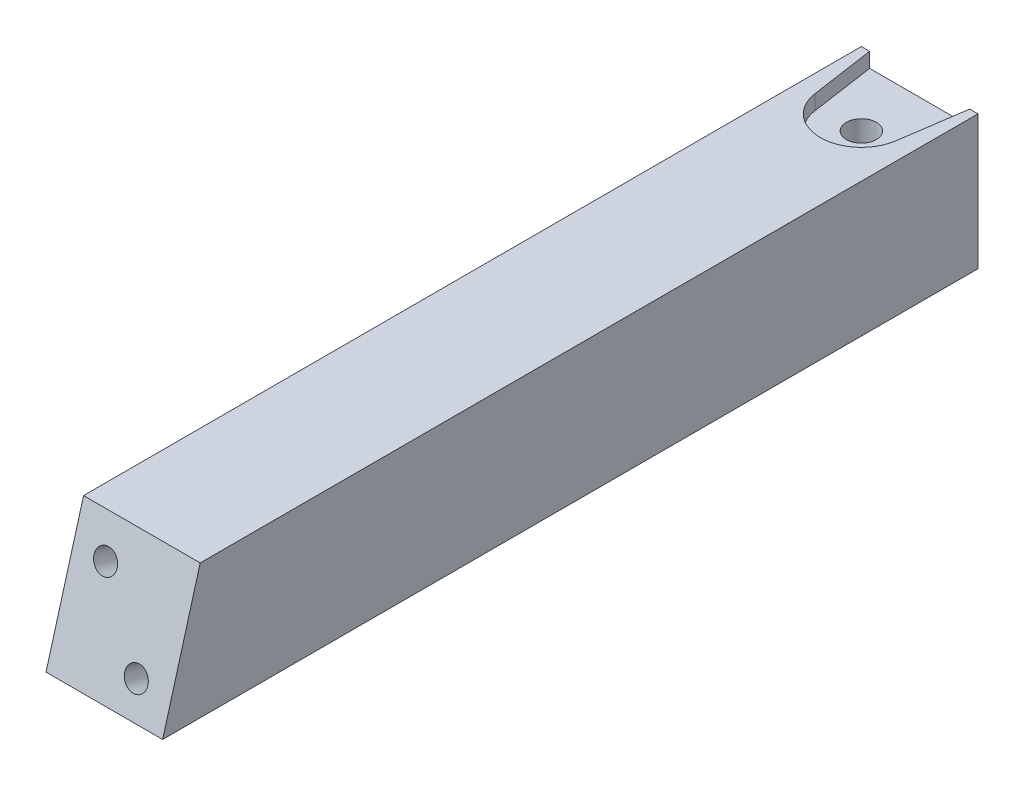
ISO-10303-21;
HEADER;
FILE_DESCRIPTION(('STEP AP214'),'2;1');
FILE_NAME('part.step','',(''),(''),'','','');
FILE_SCHEMA(('AUTOMOTIVE_DESIGN { 1 0 10303 214 1 1 1 1 }'));
ENDSEC;
DATA;
#1=APPLICATION_CONTEXT('core data for automotive mechanical design processes');
#2=APPLICATION_PROTOCOL_DEFINITION('international standard','automotive_design',2000,#1);
#3=PRODUCT_CONTEXT('',#1,'mechanical');
#4=PRODUCT('Part','Part','',(#3));
#5=PRODUCT_RELATED_PRODUCT_CATEGORY('part','',(#4));
#6=PRODUCT_DEFINITION_FORMATION('','',#4);
#7=PRODUCT_DEFINITION_CONTEXT('part definition',#1,'design');
#8=PRODUCT_DEFINITION('design','',#6,#7);
#9=PRODUCT_DEFINITION_SHAPE('','',#8);
#10=(LENGTH_UNIT() NAMED_UNIT(*) SI_UNIT(.MILLI.,.METRE.));
#11=(NAMED_UNIT(*) PLANE_ANGLE_UNIT() SI_UNIT($,.RADIAN.));
#12=(NAMED_UNIT(*) SI_UNIT($,.STERADIAN.) SOLID_ANGLE_UNIT());
#13=UNCERTAINTY_MEASURE_WITH_UNIT(LENGTH_MEASURE(1.E-05),#10,'distance_accuracy_value','');
#14=(GEOMETRIC_REPRESENTATION_CONTEXT(3) GLOBAL_UNCERTAINTY_ASSIGNED_CONTEXT((#13)) GLOBAL_UNIT_ASSIGNED_CONTEXT((#10,
#11,#12)) REPRESENTATION_CONTEXT('',''));
#15=CARTESIAN_POINT('',(0.,0.,0.));
#16=DIRECTION('',(0.,0.,1.));
#17=DIRECTION('',(1.,0.,0.));
#18=AXIS2_PLACEMENT_3D('',#15,#16,#17);
#19=CARTESIAN_POINT('',(0.,14.605,-12.7));
#20=DIRECTION('',(0.,1.,0.));
#21=DIRECTION('',(0.,0.,-1.));
#22=AXIS2_PLACEMENT_3D('',#19,#20,#21);
#23=PLANE('',#22);
#24=DIRECTION('',(-0.145074568979481,0.,-0.989420724179264));
#25=VECTOR('',#24,1.);
#26=CARTESIAN_POINT('',(-10.6691680815078,14.605,-11.1356250854981));
#27=LINE('',#26,#25);
#28=CARTESIAN_POINT('',(-8.84621281074196,14.605,1.29708270633174));
#29=VERTEX_POINT('',#28);
#30=CARTESIAN_POINT('',(-10.8985457475476,14.605,-12.7));
#31=VERTEX_POINT('',#30);
#32=EDGE_CURVE('E235',#29,#31,#27,.T.);
#33=ORIENTED_EDGE('',*,*,#32,.T.);
#34=DIRECTION('',(1.,0.,0.));
#35=VECTOR('',#34,1.);
#36=CARTESIAN_POINT('',(0.,14.605,-12.7));
#37=LINE('',#36,#35);
#38=CARTESIAN_POINT('',(-12.7,14.605,-12.7));
#39=VERTEX_POINT('',#38);
#40=EDGE_CURVE('E177',#39,#31,#37,.T.);
#41=ORIENTED_EDGE('',*,*,#40,.F.);
#42=DIRECTION('',(0.,0.,1.));
#43=VECTOR('',#42,1.);
#44=CARTESIAN_POINT('',(-12.7,14.605,-12.7));
#45=LINE('',#44,#43);
#46=CARTESIAN_POINT('',(-12.7,14.605,156.672537514928));
#47=VERTEX_POINT('',#46);
#48=EDGE_CURVE('E185',#39,#47,#45,.T.);
#49=ORIENTED_EDGE('',*,*,#48,.T.);
#50=DIRECTION('',(1.,0.,0.));
#51=VECTOR('',#50,1.);
#52=CARTESIAN_POINT('',(0.,14.605,156.672537514928));
#53=LINE('',#52,#51);
#54=CARTESIAN_POINT('',(12.7,14.605,156.672537514928));
#55=VERTEX_POINT('',#54);
#56=EDGE_CURVE('E173',#47,#55,#53,.T.);
#57=ORIENTED_EDGE('',*,*,#56,.T.);
#58=DIRECTION('',(0.,0.,1.));
#59=VECTOR('',#58,1.);
#60=CARTESIAN_POINT('',(12.7,14.605,-12.7));
#61=LINE('',#60,#59);
#62=CARTESIAN_POINT('',(12.7,14.605,-12.7));
#63=VERTEX_POINT('',#62);
#64=EDGE_CURVE('E188',#63,#55,#61,.T.);
#65=ORIENTED_EDGE('',*,*,#64,.F.);
#66=CARTESIAN_POINT('',(10.8985457475476,14.605,-12.7));
#67=VERTEX_POINT('',#66);
#68=EDGE_CURVE('E176',#67,#63,#37,.T.);
#69=ORIENTED_EDGE('',*,*,#68,.F.);
#70=DIRECTION('',(0.145074568979481,0.,-0.989420724179264));
#71=VECTOR('',#70,1.);
#72=CARTESIAN_POINT('',(10.6691680815078,14.605,-11.1356250854981));
#73=LINE('',#72,#71);
#74=CARTESIAN_POINT('',(8.84621281074195,14.605,1.29708270633174));
#75=VERTEX_POINT('',#74);
#76=EDGE_CURVE('E232',#75,#67,#73,.T.);
#77=ORIENTED_EDGE('',*,*,#76,.F.);
#78=CARTESIAN_POINT('',(0.,14.605,0.));
#79=DIRECTION('',(0.,-1.,0.));
#80=DIRECTION('',(0.,0.,-1.));
#81=AXIS2_PLACEMENT_3D('',#78,#79,#80);
#82=CIRCLE('',#81,8.9408);
#83=EDGE_CURVE('E51',#29,#75,#82,.F.);
#84=ORIENTED_EDGE('',*,*,#83,.F.);
#85=EDGE_LOOP('',(#33,#41,#49,#57,#65,#69,#77,#84));
#86=FACE_BOUND('',#85,.T.);
#87=ADVANCED_FACE('F43',(#86),#23,.T.);
#88=CARTESIAN_POINT('',(0.,-14.605,-12.7));
#89=DIRECTION('',(0.,1.,0.));
#90=DIRECTION('',(0.,0.,-1.));
#91=AXIS2_PLACEMENT_3D('',#88,#89,#90);
#92=PLANE('',#91);
#93=DIRECTION('',(-1.,0.,0.));
#94=VECTOR('',#93,1.);
#95=CARTESIAN_POINT('',(0.,-14.605,145.067348417265));
#96=LINE('',#95,#94);
#97=CARTESIAN_POINT('',(6.99258936750375,-14.605,145.067348417265));
#98=VERTEX_POINT('',#97);
#99=CARTESIAN_POINT('',(3.16741063249625,-14.605,145.067348417265));
#100=VERTEX_POINT('',#99);
#101=EDGE_CURVE('E11',#98,#100,#96,.T.);
#102=ORIENTED_EDGE('',*,*,#101,.T.);
#103=CARTESIAN_POINT('',(5.08,-14.605,138.939159755567));
#104=DIRECTION('',(0.,-1.,0.));
#105=DIRECTION('',(0.,0.,1.));
#106=AXIS2_PLACEMENT_3D('',#103,#104,#105);
#107=ELLIPSE('',#106,9.37491821077206,2.5273);
#108=EDGE_CURVE('E141',#98,#100,#107,.T.);
#109=ORIENTED_EDGE('',*,*,#108,.F.);
#110=EDGE_LOOP('',(#102,#109));
#111=FACE_BOUND('',#110,.T.);
#112=DIRECTION('',(1.,0.,0.));
#113=VECTOR('',#112,1.);
#114=CARTESIAN_POINT('',(0.,-14.605,-12.7));
#115=LINE('',#114,#113);
#116=CARTESIAN_POINT('',(10.8985457475476,-14.605,-12.7));
#117=VERTEX_POINT('',#116);
#118=CARTESIAN_POINT('',(12.7,-14.605,-12.7));
#119=VERTEX_POINT('',#118);
#120=EDGE_CURVE('E154',#117,#119,#115,.T.);
#121=ORIENTED_EDGE('',*,*,#120,.T.);
#122=DIRECTION('',(0.,0.,1.));
#123=VECTOR('',#122,1.);
#124=CARTESIAN_POINT('',(12.7,-14.605,-12.7));
#125=LINE('',#124,#123);
#126=CARTESIAN_POINT('',(12.7,-14.605,164.849737725037));
#127=VERTEX_POINT('',#126);
#128=EDGE_CURVE('E157',#119,#127,#125,.T.);
#129=ORIENTED_EDGE('',*,*,#128,.T.);
#130=DIRECTION('',(1.,0.,0.));
#131=VECTOR('',#130,1.);
#132=CARTESIAN_POINT('',(0.,-14.605,164.849737725037));
#133=LINE('',#132,#131);
#134=CARTESIAN_POINT('',(-12.7,-14.605,164.849737725037));
#135=VERTEX_POINT('',#134);
#136=EDGE_CURVE('E164',#135,#127,#133,.T.);
#137=ORIENTED_EDGE('',*,*,#136,.F.);
#138=DIRECTION('',(0.,0.,1.));
#139=VECTOR('',#138,1.);
#140=CARTESIAN_POINT('',(-12.7,-14.605,-12.7));
#141=LINE('',#140,#139);
#142=CARTESIAN_POINT('',(-12.7,-14.605,-12.7));
#143=VERTEX_POINT('',#142);
#144=EDGE_CURVE('E182',#143,#135,#141,.T.);
#145=ORIENTED_EDGE('',*,*,#144,.F.);
#146=CARTESIAN_POINT('',(-10.8985457475476,-14.605,-12.7));
#147=VERTEX_POINT('',#146);
#148=EDGE_CURVE('E163',#143,#147,#115,.T.);
#149=ORIENTED_EDGE('',*,*,#148,.T.);
#150=DIRECTION('',(0.145074568979481,0.,0.989420724179264));
#151=VECTOR('',#150,1.);
#152=CARTESIAN_POINT('',(-10.6691680815078,-14.605,-11.1356250854981));
#153=LINE('',#152,#151);
#154=CARTESIAN_POINT('',(-8.84621281074195,-14.605,1.29708270633174));
#155=VERTEX_POINT('',#154);
#156=EDGE_CURVE('E246',#147,#155,#153,.T.);
#157=ORIENTED_EDGE('',*,*,#156,.T.);
#158=CARTESIAN_POINT('',(0.,-14.605,0.));
#159=DIRECTION('',(0.,-1.,0.));
#160=DIRECTION('',(0.,0.,-1.));
#161=AXIS2_PLACEMENT_3D('',#158,#159,#160);
#162=CIRCLE('',#161,8.9408);
#163=CARTESIAN_POINT('',(8.84621281074196,-14.605,1.29708270633174));
#164=VERTEX_POINT('',#163);
#165=EDGE_CURVE('E200',#164,#155,#162,.T.);
#166=ORIENTED_EDGE('',*,*,#165,.F.);
#167=DIRECTION('',(-0.145074568979481,0.,0.989420724179264));
#168=VECTOR('',#167,1.);
#169=CARTESIAN_POINT('',(10.6691680815078,-14.605,-11.1356250854981));
#170=LINE('',#169,#168);
#171=EDGE_CURVE('E160',#117,#164,#170,.T.);
#172=ORIENTED_EDGE('',*,*,#171,.F.);
#173=EDGE_LOOP('',(#121,#129,#137,#145,#149,#157,#166,#172));
#174=FACE_BOUND('',#173,.T.);
#175=ADVANCED_FACE('F45',(#111,#174),#92,.F.);
#176=CARTESIAN_POINT('',(12.7,0.,-12.7));
#177=DIRECTION('',(-1.,0.,0.));
#178=DIRECTION('',(0.,0.,-1.));
#179=AXIS2_PLACEMENT_3D('',#176,#177,#178);
#180=PLANE('',#179);
#181=DIRECTION('',(0.,0.962977712328957,-0.26958101854116));
#182=VECTOR('',#181,1.);
#183=CARTESIAN_POINT('',(12.7,-10.2420351219003,163.628346512511));
#184=LINE('',#183,#182);
#185=EDGE_CURVE('E169',#127,#55,#184,.T.);
#186=ORIENTED_EDGE('',*,*,#185,.F.);
#187=ORIENTED_EDGE('',*,*,#128,.F.);
#188=DIRECTION('',(0.,1.,0.));
#189=VECTOR('',#188,1.);
#190=CARTESIAN_POINT('',(12.7,0.,-12.7));
#191=LINE('',#190,#189);
#192=EDGE_CURVE('E167',#119,#63,#191,.T.);
#193=ORIENTED_EDGE('',*,*,#192,.T.);
#194=ORIENTED_EDGE('',*,*,#64,.T.);
#195=EDGE_LOOP('',(#186,#187,#193,#194));
#196=FACE_BOUND('',#195,.T.);
#197=ADVANCED_FACE('F149',(#196),#180,.F.);
#198=CARTESIAN_POINT('',(-12.7,0.,-12.7));
#199=DIRECTION('',(-1.,0.,0.));
#200=DIRECTION('',(0.,0.,-1.));
#201=AXIS2_PLACEMENT_3D('',#198,#199,#200);
#202=PLANE('',#201);
#203=DIRECTION('',(0.,0.962977712328957,-0.26958101854116));
#204=VECTOR('',#203,1.);
#205=CARTESIAN_POINT('',(-12.7,-10.2420351219003,163.628346512511));
#206=LINE('',#205,#204);
#207=EDGE_CURVE('E255',#135,#47,#206,.T.);
#208=ORIENTED_EDGE('',*,*,#207,.T.);
#209=ORIENTED_EDGE('',*,*,#48,.F.);
#210=DIRECTION('',(0.,1.,0.));
#211=VECTOR('',#210,1.);
#212=CARTESIAN_POINT('',(-12.7,0.,-12.7));
#213=LINE('',#212,#211);
#214=EDGE_CURVE('E180',#143,#39,#213,.T.);
#215=ORIENTED_EDGE('',*,*,#214,.F.);
#216=ORIENTED_EDGE('',*,*,#144,.T.);
#217=EDGE_LOOP('',(#208,#209,#215,#216));
#218=FACE_BOUND('',#217,.T.);
#219=ADVANCED_FACE('F280',(#218),#202,.T.);
#220=CARTESIAN_POINT('',(0.,0.,-12.7));
#221=DIRECTION('',(0.,0.,-1.));
#222=DIRECTION('',(1.,0.,0.));
#223=AXIS2_PLACEMENT_3D('',#220,#221,#222);
#224=PLANE('',#223);
#225=DIRECTION('',(0.,-1.,0.));
#226=VECTOR('',#225,1.);
#227=CARTESIAN_POINT('',(-10.8985457475476,0.,-12.7));
#228=LINE('',#227,#226);
#229=CARTESIAN_POINT('',(-10.8985457475476,11.3792,-12.7));
#230=VERTEX_POINT('',#229);
#231=EDGE_CURVE('E208',#31,#230,#228,.T.);
#232=ORIENTED_EDGE('',*,*,#231,.T.);
#233=DIRECTION('',(-1.,0.,0.));
#234=VECTOR('',#233,1.);
#235=CARTESIAN_POINT('',(0.,11.3792,-12.7));
#236=LINE('',#235,#234);
#237=CARTESIAN_POINT('',(10.8985457475476,11.3792,-12.7));
#238=VERTEX_POINT('',#237);
#239=EDGE_CURVE('E203',#238,#230,#236,.T.);
#240=ORIENTED_EDGE('',*,*,#239,.F.);
#241=DIRECTION('',(0.,-1.,0.));
#242=VECTOR('',#241,1.);
#243=CARTESIAN_POINT('',(10.8985457475476,0.,-12.7));
#244=LINE('',#243,#242);
#245=EDGE_CURVE('E205',#67,#238,#244,.T.);
#246=ORIENTED_EDGE('',*,*,#245,.F.);
#247=ORIENTED_EDGE('',*,*,#68,.T.);
#248=ORIENTED_EDGE('',*,*,#192,.F.);
#249=ORIENTED_EDGE('',*,*,#120,.F.);
#250=DIRECTION('',(0.,1.,0.));
#251=VECTOR('',#250,1.);
#252=CARTESIAN_POINT('',(10.8985457475476,0.,-12.7));
#253=LINE('',#252,#251);
#254=CARTESIAN_POINT('',(10.8985457475476,-11.3792,-12.7));
#255=VERTEX_POINT('',#254);
#256=EDGE_CURVE('E198',#117,#255,#253,.T.);
#257=ORIENTED_EDGE('',*,*,#256,.T.);
#258=DIRECTION('',(-1.,0.,0.));
#259=VECTOR('',#258,1.);
#260=CARTESIAN_POINT('',(0.,-11.3792,-12.7));
#261=LINE('',#260,#259);
#262=CARTESIAN_POINT('',(-10.8985457475476,-11.3792,-12.7));
#263=VERTEX_POINT('',#262);
#264=EDGE_CURVE('E195',#255,#263,#261,.T.);
#265=ORIENTED_EDGE('',*,*,#264,.T.);
#266=DIRECTION('',(0.,1.,0.));
#267=VECTOR('',#266,1.);
#268=CARTESIAN_POINT('',(-10.8985457475476,0.,-12.7));
#269=LINE('',#268,#267);
#270=EDGE_CURVE('E192',#147,#263,#269,.T.);
#271=ORIENTED_EDGE('',*,*,#270,.F.);
#272=ORIENTED_EDGE('',*,*,#148,.F.);
#273=ORIENTED_EDGE('',*,*,#214,.T.);
#274=ORIENTED_EDGE('',*,*,#40,.T.);
#275=EDGE_LOOP('',(#232,#240,#246,#247,#248,#249,#257,#265,#271,#272,#273,#274));
#276=FACE_BOUND('',#275,.T.);
#277=ADVANCED_FACE('F268',(#276),#224,.T.);
#278=CARTESIAN_POINT('',(-223.778265585856,534.660082965459,11.0855969571135));
#279=DIRECTION('',(0.,0.26958101854116,0.962977712328957));
#280=DIRECTION('',(0.,0.962977712328957,-0.26958101854116));
#281=AXIS2_PLACEMENT_3D('',#278,#279,#280);
#282=PLANE('',#281);
#283=CARTESIAN_POINT('',(-5.71499999999999,6.79717965651106,158.85829958796));
#284=DIRECTION('',(0.,-0.26958101854116,-0.962977712328957));
#285=DIRECTION('',(0.,0.962977712328957,-0.26958101854116));
#286=AXIS2_PLACEMENT_3D('',#283,#284,#285);
#287=CIRCLE('',#286,2.5273);
#288=CARTESIAN_POINT('',(-5.71499999999999,9.23091322888003,158.176987479801));
#289=VERTEX_POINT('',#288);
#290=EDGE_CURVE('E468',#289,#289,#287,.T.);
#291=ORIENTED_EDGE('',*,*,#290,.T.);
#292=EDGE_LOOP('',(#291));
#293=FACE_BOUND('',#292,.T.);
#294=CARTESIAN_POINT('',(5.08,-7.87860067938224,162.966714310527));
#295=DIRECTION('',(0.,-0.26958101854116,-0.962977712328957));
#296=DIRECTION('',(0.,0.962977712328957,-0.26958101854116));
#297=AXIS2_PLACEMENT_3D('',#294,#295,#296);
#298=CIRCLE('',#297,2.5273);
#299=CARTESIAN_POINT('',(5.08,-5.44486710701327,162.285402202368));
#300=VERTEX_POINT('',#299);
#301=EDGE_CURVE('E139',#300,#300,#298,.T.);
#302=ORIENTED_EDGE('',*,*,#301,.T.);
#303=EDGE_LOOP('',(#302));
#304=FACE_BOUND('',#303,.T.);
#305=ORIENTED_EDGE('',*,*,#136,.T.);
#306=ORIENTED_EDGE('',*,*,#185,.T.);
#307=ORIENTED_EDGE('',*,*,#56,.F.);
#308=ORIENTED_EDGE('',*,*,#207,.F.);
#309=EDGE_LOOP('',(#305,#306,#307,#308));
#310=FACE_BOUND('',#309,.T.);
#311=ADVANCED_FACE('F265',(#293,#304,#310),#282,.T.);
#312=CARTESIAN_POINT('',(0.,-14.605,0.));
#313=DIRECTION('',(0.,1.,0.));
#314=DIRECTION('',(0.,0.,1.));
#315=AXIS2_PLACEMENT_3D('',#312,#313,#314);
#316=CYLINDRICAL_SURFACE('',#315,8.9408);
#317=DIRECTION('',(0.,-1.,0.));
#318=VECTOR('',#317,1.);
#319=CARTESIAN_POINT('',(8.84621281074196,-14.605,1.29708270633174));
#320=LINE('',#319,#318);
#321=CARTESIAN_POINT('',(8.84621281074196,-11.3792,1.29708270633174));
#322=VERTEX_POINT('',#321);
#323=EDGE_CURVE('E241',#164,#322,#320,.F.);
#324=ORIENTED_EDGE('',*,*,#323,.F.);
#325=ORIENTED_EDGE('',*,*,#165,.T.);
#326=DIRECTION('',(0.,1.,0.));
#327=VECTOR('',#326,1.);
#328=CARTESIAN_POINT('',(-8.84621281074195,-14.605,1.29708270633174));
#329=LINE('',#328,#327);
#330=CARTESIAN_POINT('',(-8.84621281074195,-11.3792,1.29708270633174));
#331=VERTEX_POINT('',#330);
#332=EDGE_CURVE('E247',#155,#331,#329,.T.);
#333=ORIENTED_EDGE('',*,*,#332,.T.);
#334=CARTESIAN_POINT('',(0.,-11.3792,0.));
#335=DIRECTION('',(0.,-1.,0.));
#336=DIRECTION('',(0.,0.,-1.));
#337=AXIS2_PLACEMENT_3D('',#334,#335,#336);
#338=CIRCLE('',#337,8.9408);
#339=EDGE_CURVE('E238',#331,#322,#338,.F.);
#340=ORIENTED_EDGE('',*,*,#339,.T.);
#341=EDGE_LOOP('',(#324,#325,#333,#340));
#342=FACE_BOUND('',#341,.T.);
#343=ADVANCED_FACE('F324',(#342),#316,.F.);
#344=CARTESIAN_POINT('',(8.84621281074196,-14.605,1.29708270633174));
#345=DIRECTION('',(0.989420724179263,0.,0.145074568979481));
#346=DIRECTION('',(0.145074568979481,0.,-0.989420724179264));
#347=AXIS2_PLACEMENT_3D('',#344,#345,#346);
#348=PLANE('',#347);
#349=ORIENTED_EDGE('',*,*,#256,.F.);
#350=ORIENTED_EDGE('',*,*,#171,.T.);
#351=ORIENTED_EDGE('',*,*,#323,.T.);
#352=DIRECTION('',(0.145074568979481,0.,-0.989420724179264));
#353=VECTOR('',#352,1.);
#354=CARTESIAN_POINT('',(8.84621281074196,-11.3792,1.29708270633174));
#355=LINE('',#354,#353);
#356=EDGE_CURVE('E239',#322,#255,#355,.T.);
#357=ORIENTED_EDGE('',*,*,#356,.T.);
#358=EDGE_LOOP('',(#349,#350,#351,#357));
#359=FACE_BOUND('',#358,.T.);
#360=ADVANCED_FACE('F334',(#359),#348,.F.);
#361=CARTESIAN_POINT('',(-8.84621281074196,-14.605,1.29708270633174));
#362=DIRECTION('',(0.989420724179263,0.,-0.145074568979481));
#363=DIRECTION('',(-0.145074568979481,0.,-0.989420724179264));
#364=AXIS2_PLACEMENT_3D('',#361,#362,#363);
#365=PLANE('',#364);
#366=ORIENTED_EDGE('',*,*,#156,.F.);
#367=ORIENTED_EDGE('',*,*,#270,.T.);
#368=DIRECTION('',(-0.145074568979481,0.,-0.989420724179264));
#369=VECTOR('',#368,1.);
#370=CARTESIAN_POINT('',(-8.84621281074196,-11.3792,1.29708270633174));
#371=LINE('',#370,#369);
#372=EDGE_CURVE('E244',#331,#263,#371,.T.);
#373=ORIENTED_EDGE('',*,*,#372,.F.);
#374=ORIENTED_EDGE('',*,*,#332,.F.);
#375=EDGE_LOOP('',(#366,#367,#373,#374));
#376=FACE_BOUND('',#375,.T.);
#377=ADVANCED_FACE('F344',(#376),#365,.T.);
#378=CARTESIAN_POINT('',(0.,-11.3792,0.));
#379=DIRECTION('',(0.,1.,0.));
#380=DIRECTION('',(0.,0.,1.));
#381=AXIS2_PLACEMENT_3D('',#378,#379,#380);
#382=PLANE('',#381);
#383=CARTESIAN_POINT('',(0.,-11.3792,0.));
#384=DIRECTION('',(0.,-1.,0.));
#385=DIRECTION('',(0.,0.,-1.));
#386=AXIS2_PLACEMENT_3D('',#383,#384,#385);
#387=CIRCLE('',#386,3.2639);
#388=CARTESIAN_POINT('',(0.,-11.3792,3.2639));
#389=VERTEX_POINT('',#388);
#390=EDGE_CURVE('E213',#389,#389,#387,.T.);
#391=ORIENTED_EDGE('',*,*,#390,.F.);
#392=EDGE_LOOP('',(#391));
#393=FACE_BOUND('',#392,.T.);
#394=ORIENTED_EDGE('',*,*,#264,.F.);
#395=ORIENTED_EDGE('',*,*,#356,.F.);
#396=ORIENTED_EDGE('',*,*,#339,.F.);
#397=ORIENTED_EDGE('',*,*,#372,.T.);
#398=EDGE_LOOP('',(#394,#395,#396,#397));
#399=FACE_BOUND('',#398,.T.);
#400=ADVANCED_FACE('F357',(#393,#399),#382,.F.);
#401=CARTESIAN_POINT('',(-8.84621281074196,14.605,1.29708270633174));
#402=DIRECTION('',(-0.989420724179263,0.,0.145074568979481));
#403=DIRECTION('',(0.145074568979481,0.,0.989420724179264));
#404=AXIS2_PLACEMENT_3D('',#401,#402,#403);
#405=PLANE('',#404);
#406=ORIENTED_EDGE('',*,*,#32,.F.);
#407=DIRECTION('',(0.,-1.,0.));
#408=VECTOR('',#407,1.);
#409=CARTESIAN_POINT('',(-8.84621281074196,14.605,1.29708270633174));
#410=LINE('',#409,#408);
#411=CARTESIAN_POINT('',(-8.84621281074196,11.3792,1.29708270633174));
#412=VERTEX_POINT('',#411);
#413=EDGE_CURVE('E223',#29,#412,#410,.T.);
#414=ORIENTED_EDGE('',*,*,#413,.T.);
#415=DIRECTION('',(-0.145074568979481,0.,-0.989420724179264));
#416=VECTOR('',#415,1.);
#417=CARTESIAN_POINT('',(-8.84621281074196,11.3792,1.29708270633174));
#418=LINE('',#417,#416);
#419=EDGE_CURVE('E65',#412,#230,#418,.T.);
#420=ORIENTED_EDGE('',*,*,#419,.T.);
#421=ORIENTED_EDGE('',*,*,#231,.F.);
#422=EDGE_LOOP('',(#406,#414,#420,#421));
#423=FACE_BOUND('',#422,.T.);
#424=ADVANCED_FACE('F277',(#423),#405,.F.);
#425=CARTESIAN_POINT('',(0.,14.605,0.));
#426=DIRECTION('',(0.,-1.,0.));
#427=DIRECTION('',(0.,0.,-1.));
#428=AXIS2_PLACEMENT_3D('',#425,#426,#427);
#429=CYLINDRICAL_SURFACE('',#428,8.9408);
#430=ORIENTED_EDGE('',*,*,#413,.F.);
#431=ORIENTED_EDGE('',*,*,#83,.T.);
#432=DIRECTION('',(0.,-1.,0.));
#433=VECTOR('',#432,1.);
#434=CARTESIAN_POINT('',(8.84621281074195,14.605,1.29708270633174));
#435=LINE('',#434,#433);
#436=CARTESIAN_POINT('',(8.84621281074195,11.3792,1.29708270633174));
#437=VERTEX_POINT('',#436);
#438=EDGE_CURVE('E224',#75,#437,#435,.T.);
#439=ORIENTED_EDGE('',*,*,#438,.T.);
#440=CARTESIAN_POINT('',(0.,11.3792,0.));
#441=DIRECTION('',(0.,-1.,0.));
#442=DIRECTION('',(0.,0.,-1.));
#443=AXIS2_PLACEMENT_3D('',#440,#441,#442);
#444=CIRCLE('',#443,8.9408);
#445=EDGE_CURVE('E220',#412,#437,#444,.F.);
#446=ORIENTED_EDGE('',*,*,#445,.F.);
#447=EDGE_LOOP('',(#430,#431,#439,#446));
#448=FACE_BOUND('',#447,.T.);
#449=ADVANCED_FACE('F276',(#448),#429,.F.);
#450=CARTESIAN_POINT('',(8.84621281074196,14.605,1.29708270633174));
#451=DIRECTION('',(-0.989420724179263,0.,-0.145074568979481));
#452=DIRECTION('',(-0.145074568979481,0.,0.989420724179264));
#453=AXIS2_PLACEMENT_3D('',#450,#451,#452);
#454=PLANE('',#453);
#455=ORIENTED_EDGE('',*,*,#438,.F.);
#456=ORIENTED_EDGE('',*,*,#76,.T.);
#457=ORIENTED_EDGE('',*,*,#245,.T.);
#458=DIRECTION('',(0.145074568979481,0.,-0.989420724179264));
#459=VECTOR('',#458,1.);
#460=CARTESIAN_POINT('',(8.84621281074196,11.3792,1.29708270633174));
#461=LINE('',#460,#459);
#462=EDGE_CURVE('E230',#437,#238,#461,.T.);
#463=ORIENTED_EDGE('',*,*,#462,.F.);
#464=EDGE_LOOP('',(#455,#456,#457,#463));
#465=FACE_BOUND('',#464,.T.);
#466=ADVANCED_FACE('F274',(#465),#454,.T.);
#467=CARTESIAN_POINT('',(0.,11.3792,0.));
#468=DIRECTION('',(0.,1.,0.));
#469=DIRECTION('',(0.,0.,1.));
#470=AXIS2_PLACEMENT_3D('',#467,#468,#469);
#471=PLANE('',#470);
#472=CARTESIAN_POINT('',(0.,11.3792,0.));
#473=DIRECTION('',(0.,-1.,0.));
#474=DIRECTION('',(0.,0.,-1.));
#475=AXIS2_PLACEMENT_3D('',#472,#473,#474);
#476=CIRCLE('',#475,3.2639);
#477=CARTESIAN_POINT('',(0.,11.3792,3.2639));
#478=VERTEX_POINT('',#477);
#479=EDGE_CURVE('E144',#478,#478,#476,.T.);
#480=ORIENTED_EDGE('',*,*,#479,.T.);
#481=EDGE_LOOP('',(#480));
#482=FACE_BOUND('',#481,.T.);
#483=ORIENTED_EDGE('',*,*,#462,.T.);
#484=ORIENTED_EDGE('',*,*,#239,.T.);
#485=ORIENTED_EDGE('',*,*,#419,.F.);
#486=ORIENTED_EDGE('',*,*,#445,.T.);
#487=EDGE_LOOP('',(#483,#484,#485,#486));
#488=FACE_BOUND('',#487,.T.);
#489=ADVANCED_FACE('F404',(#482,#488),#471,.T.);
#490=CARTESIAN_POINT('',(0.,14.605,0.));
#491=DIRECTION('',(0.,-1.,0.));
#492=DIRECTION('',(0.,0.,1.));
#493=AXIS2_PLACEMENT_3D('',#490,#491,#492);
#494=CYLINDRICAL_SURFACE('',#493,3.2639);
#495=CARTESIAN_POINT('',(0.,11.3792,3.2639));
#496=CARTESIAN_POINT('',(0.,11.1421333333333,3.2639));
#497=CARTESIAN_POINT('',(0.,10.9050666666667,3.2639));
#498=CARTESIAN_POINT('',(0.,10.4309333333333,3.2639));
#499=CARTESIAN_POINT('',(0.,10.1938666666667,3.2639));
#500=CARTESIAN_POINT('',(0.,9.71973333333333,3.2639));
#501=CARTESIAN_POINT('',(0.,9.48266666666667,3.2639));
#502=CARTESIAN_POINT('',(0.,9.00853333333333,3.2639));
#503=CARTESIAN_POINT('',(0.,8.77146666666667,3.2639));
#504=CARTESIAN_POINT('',(0.,8.29733333333333,3.2639));
#505=CARTESIAN_POINT('',(0.,8.06026666666667,3.2639));
#506=CARTESIAN_POINT('',(0.,7.58613333333333,3.2639));
#507=CARTESIAN_POINT('',(0.,7.34906666666667,3.2639));
#508=CARTESIAN_POINT('',(0.,6.87493333333333,3.2639));
#509=CARTESIAN_POINT('',(0.,6.63786666666667,3.2639));
#510=CARTESIAN_POINT('',(0.,6.16373333333333,3.2639));
#511=CARTESIAN_POINT('',(0.,5.92666666666667,3.2639));
#512=CARTESIAN_POINT('',(0.,5.45253333333334,3.2639));
#513=CARTESIAN_POINT('',(0.,5.21546666666667,3.2639));
#514=CARTESIAN_POINT('',(0.,4.74133333333333,3.2639));
#515=CARTESIAN_POINT('',(0.,4.50426666666667,3.2639));
#516=CARTESIAN_POINT('',(0.,4.03013333333333,3.2639));
#517=CARTESIAN_POINT('',(0.,3.79306666666667,3.2639));
#518=CARTESIAN_POINT('',(0.,3.31893333333333,3.2639));
#519=CARTESIAN_POINT('',(0.,3.08186666666667,3.2639));
#520=CARTESIAN_POINT('',(0.,2.60773333333333,3.2639));
#521=CARTESIAN_POINT('',(0.,2.37066666666667,3.2639));
#522=CARTESIAN_POINT('',(0.,1.89653333333333,3.2639));
#523=CARTESIAN_POINT('',(0.,1.65946666666667,3.2639));
#524=CARTESIAN_POINT('',(0.,1.18533333333334,3.2639));
#525=CARTESIAN_POINT('',(0.,0.948266666666668,3.2639));
#526=CARTESIAN_POINT('',(0.,0.474133333333334,3.2639));
#527=CARTESIAN_POINT('',(0.,0.237066666666668,3.2639));
#528=CARTESIAN_POINT('',(0.,-0.237066666666666,3.2639));
#529=CARTESIAN_POINT('',(0.,-0.474133333333333,3.2639));
#530=CARTESIAN_POINT('',(0.,-0.948266666666666,3.2639));
#531=CARTESIAN_POINT('',(0.,-1.18533333333333,3.2639));
#532=CARTESIAN_POINT('',(0.,-1.65946666666666,3.2639));
#533=CARTESIAN_POINT('',(0.,-1.89653333333333,3.2639));
#534=CARTESIAN_POINT('',(0.,-2.37066666666666,3.2639));
#535=CARTESIAN_POINT('',(0.,-2.60773333333333,3.2639));
#536=CARTESIAN_POINT('',(0.,-3.08186666666666,3.2639));
#537=CARTESIAN_POINT('',(0.,-3.31893333333333,3.2639));
#538=CARTESIAN_POINT('',(0.,-3.79306666666666,3.2639));
#539=CARTESIAN_POINT('',(0.,-4.03013333333333,3.2639));
#540=CARTESIAN_POINT('',(0.,-4.50426666666667,3.2639));
#541=CARTESIAN_POINT('',(0.,-4.74133333333333,3.2639));
#542=CARTESIAN_POINT('',(0.,-5.21546666666667,3.2639));
#543=CARTESIAN_POINT('',(0.,-5.45253333333333,3.2639));
#544=CARTESIAN_POINT('',(0.,-5.92666666666667,3.2639));
#545=CARTESIAN_POINT('',(0.,-6.16373333333333,3.2639));
#546=CARTESIAN_POINT('',(0.,-6.63786666666667,3.2639));
#547=CARTESIAN_POINT('',(0.,-6.87493333333333,3.2639));
#548=CARTESIAN_POINT('',(0.,-7.34906666666667,3.2639));
#549=CARTESIAN_POINT('',(0.,-7.58613333333333,3.2639));
#550=CARTESIAN_POINT('',(0.,-8.06026666666667,3.2639));
#551=CARTESIAN_POINT('',(0.,-8.29733333333333,3.2639));
#552=CARTESIAN_POINT('',(0.,-8.77146666666667,3.2639));
#553=CARTESIAN_POINT('',(0.,-9.00853333333333,3.2639));
#554=CARTESIAN_POINT('',(0.,-9.48266666666667,3.2639));
#555=CARTESIAN_POINT('',(0.,-9.71973333333333,3.2639));
#556=CARTESIAN_POINT('',(0.,-10.1938666666667,3.2639));
#557=CARTESIAN_POINT('',(0.,-10.4309333333333,3.2639));
#558=CARTESIAN_POINT('',(0.,-10.9050666666667,3.2639));
#559=CARTESIAN_POINT('',(0.,-11.1421333333333,3.2639));
#560=CARTESIAN_POINT('',(0.,-11.3792,3.2639));
#561=B_SPLINE_CURVE_WITH_KNOTS('',3,(#495,#496,#497,#498,#499,#500,#501,#502,#503,#504,#505,
#506,#507,#508,#509,#510,#511,#512,#513,#514,#515,#516,#517,#518,#519,#520,#521,#522,#523,#524,
#525,#526,#527,#528,#529,#530,#531,#532,#533,#534,#535,#536,#537,#538,#539,#540,#541,#542,#543,
#544,#545,#546,#547,#548,#549,#550,#551,#552,#553,#554,#555,#556,#557,#558,#559,#560),
.UNSPECIFIED.,.F.,.F.,(4,2,2,2,2,2,2,2,2,2,2,2,2,2,2,2,2,2,2,2,2,2,2,2,2,2,2,2,2,2,2,2,4),(0.,
0.7112,1.4224,2.1336,2.8448,3.556,4.2672,4.9784,5.6896,6.4008,7.112,7.8232,8.5344,9.2456,9.9568,
10.668,11.3792,12.0904,12.8016,13.5128,14.224,14.9352,15.6464,16.3576,17.0688,17.78,18.4912,
19.2024,19.9136,20.6248,21.336,22.0472,22.7584),.UNSPECIFIED.);
#562=EDGE_CURVE('BSEAM412',#478,#389,#561,.T.);
#563=ORIENTED_EDGE('',*,*,#479,.F.);
#564=ORIENTED_EDGE('',*,*,#390,.T.);
#565=ORIENTED_EDGE('',*,*,#562,.T.);
#566=ORIENTED_EDGE('',*,*,#562,.F.);
#567=EDGE_LOOP('',(#563,#565,#564,#566));
#568=FACE_BOUND('',#567,.T.);
#569=ADVANCED_FACE('F412',(#568),#494,.F.);
#570=CARTESIAN_POINT('',(5.08,-13.0141190825913,144.621988890661));
#571=DIRECTION('',(0.,0.26958101854116,0.962977712328957));
#572=DIRECTION('',(0.,0.962977712328957,-0.26958101854116));
#573=AXIS2_PLACEMENT_3D('',#570,#571,#572);
#574=PLANE('',#573);
#575=ORIENTED_EDGE('',*,*,#101,.F.);
#576=CARTESIAN_POINT('',(5.08,-13.0141190825913,144.621988890661));
#577=DIRECTION('',(0.,-0.26958101854116,-0.962977712328957));
#578=DIRECTION('',(0.,0.962977712328957,-0.26958101854116));
#579=AXIS2_PLACEMENT_3D('',#576,#577,#578);
#580=CIRCLE('',#579,2.5273);
#581=EDGE_CURVE('E57',#100,#98,#580,.T.);
#582=ORIENTED_EDGE('',*,*,#581,.F.);
#583=EDGE_LOOP('',(#575,#582));
#584=FACE_BOUND('',#583,.T.);
#585=ADVANCED_FACE('F138',(#584),#574,.T.);
#586=CARTESIAN_POINT('',(5.08,-13.0141190825913,144.621988890661));
#587=DIRECTION('',(0.,0.26958101854116,0.962977712328957));
#588=DIRECTION('',(0.,0.962977712328957,-0.26958101854116));
#589=AXIS2_PLACEMENT_3D('',#586,#587,#588);
#590=CYLINDRICAL_SURFACE('',#589,2.5273);
#591=ORIENTED_EDGE('',*,*,#301,.F.);
#592=EDGE_LOOP('',(#591));
#593=FACE_BOUND('',#592,.T.);
#594=ORIENTED_EDGE('',*,*,#581,.T.);
#595=ORIENTED_EDGE('',*,*,#108,.T.);
#596=EDGE_LOOP('',(#594,#595));
#597=FACE_BOUND('',#596,.T.);
#598=ADVANCED_FACE('F142',(#593,#597),#590,.F.);
#599=CARTESIAN_POINT('',(-5.715,1.66166125330196,140.513574168094));
#600=DIRECTION('',(0.,0.26958101854116,0.962977712328957));
#601=DIRECTION('',(0.,0.962977712328957,-0.26958101854116));
#602=AXIS2_PLACEMENT_3D('',#599,#600,#601);
#603=CYLINDRICAL_SURFACE('',#602,2.5273);
#604=CARTESIAN_POINT('',(-5.715,1.66166125330196,140.513574168094));
#605=DIRECTION('',(0.,-0.26958101854116,-0.962977712328957));
#606=DIRECTION('',(0.,0.962977712328957,-0.26958101854116));
#607=AXIS2_PLACEMENT_3D('',#604,#605,#606);
#608=CIRCLE('',#607,2.5273);
#609=CARTESIAN_POINT('',(-5.715,4.09539482567093,139.832262059935));
#610=VERTEX_POINT('',#609);
#611=EDGE_CURVE('E145',#610,#610,#608,.T.);
#612=ORIENTED_EDGE('',*,*,#611,.T.);
#613=EDGE_LOOP('',(#612));
#614=FACE_BOUND('',#613,.T.);
#615=ORIENTED_EDGE('',*,*,#290,.F.);
#616=EDGE_LOOP('',(#615));
#617=FACE_BOUND('',#616,.T.);
#618=ADVANCED_FACE('F443',(#614,#617),#603,.F.);
#619=CARTESIAN_POINT('',(-5.715,1.66166125330196,140.513574168094));
#620=DIRECTION('',(0.,0.26958101854116,0.962977712328957));
#621=DIRECTION('',(0.,0.962977712328957,-0.26958101854116));
#622=AXIS2_PLACEMENT_3D('',#619,#620,#621);
#623=PLANE('',#622);
#624=ORIENTED_EDGE('',*,*,#611,.F.);
#625=EDGE_LOOP('',(#624));
#626=FACE_BOUND('',#625,.T.);
#627=ADVANCED_FACE('F453',(#626),#623,.T.);
#628=CLOSED_SHELL('',(#87,#175,#197,#219,#277,#311,#343,#360,#377,#400,#424,#449,#466,#489,#569,
#585,#598,#618,#627));
#629=MANIFOLD_SOLID_BREP('B2',#628);
#630=ADVANCED_BREP_SHAPE_REPRESENTATION('',(#18,#629),#14);
#631=SHAPE_DEFINITION_REPRESENTATION(#9,#630);
ENDSEC;
END-ISO-10303-21;
